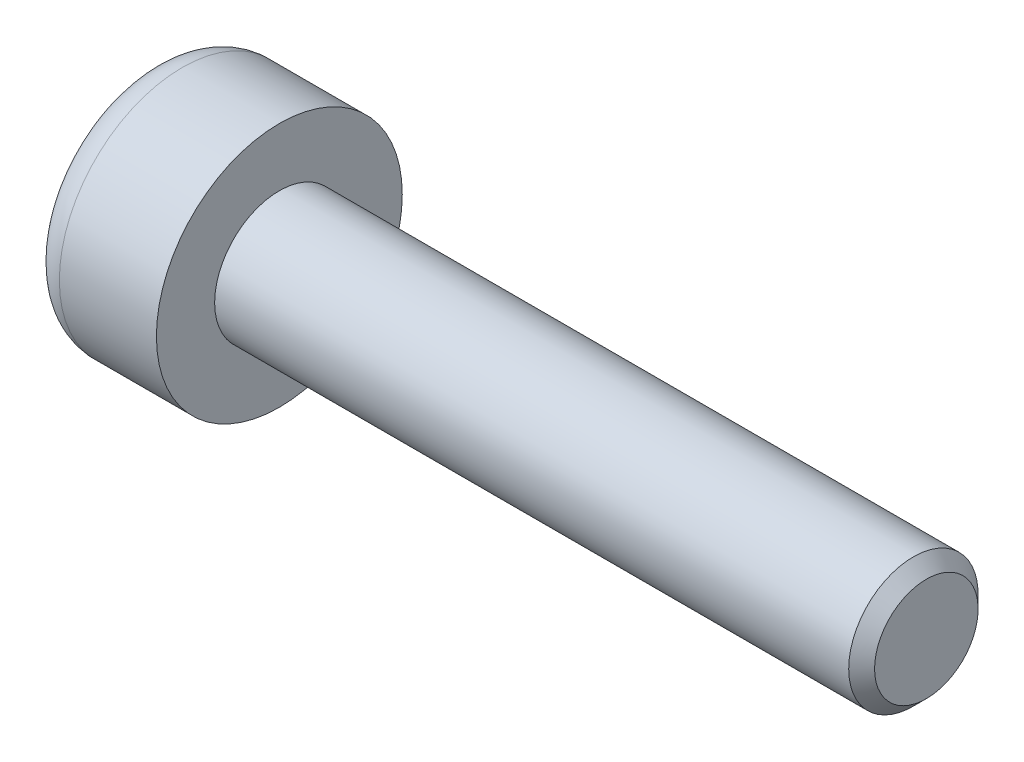
ISO-10303-21;
HEADER;
FILE_DESCRIPTION(('STEP AP214'),'2;1');
FILE_NAME('part.step','',(''),(''),'','','');
FILE_SCHEMA(('AUTOMOTIVE_DESIGN { 1 0 10303 214 1 1 1 1 }'));
ENDSEC;
DATA;
#1=APPLICATION_CONTEXT('core data for automotive mechanical design processes');
#2=APPLICATION_PROTOCOL_DEFINITION('international standard','automotive_design',2000,#1);
#3=PRODUCT_CONTEXT('',#1,'mechanical');
#4=PRODUCT('Part','Part','',(#3));
#5=PRODUCT_RELATED_PRODUCT_CATEGORY('part','',(#4));
#6=PRODUCT_DEFINITION_FORMATION('','',#4);
#7=PRODUCT_DEFINITION_CONTEXT('part definition',#1,'design');
#8=PRODUCT_DEFINITION('design','',#6,#7);
#9=PRODUCT_DEFINITION_SHAPE('','',#8);
#10=(LENGTH_UNIT() NAMED_UNIT(*) SI_UNIT(.MILLI.,.METRE.));
#11=(NAMED_UNIT(*) PLANE_ANGLE_UNIT() SI_UNIT($,.RADIAN.));
#12=(NAMED_UNIT(*) SI_UNIT($,.STERADIAN.) SOLID_ANGLE_UNIT());
#13=UNCERTAINTY_MEASURE_WITH_UNIT(LENGTH_MEASURE(1.E-05),#10,'distance_accuracy_value','');
#14=(GEOMETRIC_REPRESENTATION_CONTEXT(3) GLOBAL_UNCERTAINTY_ASSIGNED_CONTEXT((#13)) GLOBAL_UNIT_ASSIGNED_CONTEXT((#10,
#11,#12)) REPRESENTATION_CONTEXT('',''));
#15=CARTESIAN_POINT('',(0.,0.,0.));
#16=DIRECTION('',(0.,0.,1.));
#17=DIRECTION('',(1.,0.,0.));
#18=AXIS2_PLACEMENT_3D('',#15,#16,#17);
#19=CARTESIAN_POINT('',(0.,0.,0.));
#20=DIRECTION('',(1.,0.,0.));
#21=DIRECTION('',(0.,0.,-1.));
#22=AXIS2_PLACEMENT_3D('',#19,#20,#21);
#23=PLANE('',#22);
#24=DIRECTION('',(0.,0.866025403784439,0.5));
#25=VECTOR('',#24,1.);
#26=CARTESIAN_POINT('',(0.,-0.75,0.433012701892219));
#27=LINE('',#26,#25);
#28=CARTESIAN_POINT('',(0.,-0.75,0.433012701892219));
#29=VERTEX_POINT('',#28);
#30=CARTESIAN_POINT('',(0.,0.,0.866025403784439));
#31=VERTEX_POINT('',#30);
#32=EDGE_CURVE('E91',#29,#31,#27,.T.);
#33=ORIENTED_EDGE('',*,*,#32,.F.);
#34=DIRECTION('',(0.,0.,1.));
#35=VECTOR('',#34,1.);
#36=CARTESIAN_POINT('',(0.,-0.75,-0.43301270189222));
#37=LINE('',#36,#35);
#38=CARTESIAN_POINT('',(0.,-0.75,-0.43301270189222));
#39=VERTEX_POINT('',#38);
#40=EDGE_CURVE('E33',#39,#29,#37,.T.);
#41=ORIENTED_EDGE('',*,*,#40,.F.);
#42=DIRECTION('',(0.,-0.866025403784439,0.5));
#43=VECTOR('',#42,1.);
#44=CARTESIAN_POINT('',(0.,0.,-0.866025403784439));
#45=LINE('',#44,#43);
#46=CARTESIAN_POINT('',(0.,0.,-0.866025403784439));
#47=VERTEX_POINT('',#46);
#48=EDGE_CURVE('E106',#47,#39,#45,.T.);
#49=ORIENTED_EDGE('',*,*,#48,.F.);
#50=DIRECTION('',(0.,-0.866025403784439,-0.5));
#51=VECTOR('',#50,1.);
#52=CARTESIAN_POINT('',(0.,0.75,-0.43301270189222));
#53=LINE('',#52,#51);
#54=CARTESIAN_POINT('',(0.,0.75,-0.43301270189222));
#55=VERTEX_POINT('',#54);
#56=EDGE_CURVE('E100',#55,#47,#53,.T.);
#57=ORIENTED_EDGE('',*,*,#56,.F.);
#58=DIRECTION('',(0.,0.,-1.));
#59=VECTOR('',#58,1.);
#60=CARTESIAN_POINT('',(0.,0.75,0.433012701892219));
#61=LINE('',#60,#59);
#62=CARTESIAN_POINT('',(0.,0.75,0.433012701892219));
#63=VERTEX_POINT('',#62);
#64=EDGE_CURVE('E98',#63,#55,#61,.T.);
#65=ORIENTED_EDGE('',*,*,#64,.F.);
#66=DIRECTION('',(0.,0.866025403784439,-0.5));
#67=VECTOR('',#66,1.);
#68=CARTESIAN_POINT('',(0.,0.,0.866025403784439));
#69=LINE('',#68,#67);
#70=EDGE_CURVE('E84',#31,#63,#69,.T.);
#71=ORIENTED_EDGE('',*,*,#70,.F.);
#72=EDGE_LOOP('',(#33,#41,#49,#57,#65,#71));
#73=FACE_BOUND('',#72,.T.);
#74=CARTESIAN_POINT('',(0.,0.,0.));
#75=DIRECTION('',(-1.,0.,0.));
#76=DIRECTION('',(0.,0.,1.));
#77=AXIS2_PLACEMENT_3D('',#74,#75,#76);
#78=CIRCLE('',#77,1.4);
#79=CARTESIAN_POINT('',(0.,0.,1.4));
#80=VERTEX_POINT('',#79);
#81=EDGE_CURVE('E12',#80,#80,#78,.T.);
#82=ORIENTED_EDGE('',*,*,#81,.T.);
#83=EDGE_LOOP('',(#82));
#84=FACE_BOUND('',#83,.T.);
#85=ADVANCED_FACE('F19',(#73,#84),#23,.F.);
#86=CARTESIAN_POINT('',(0.5,0.,0.));
#87=DIRECTION('',(-1.,0.,0.));
#88=DIRECTION('',(0.,0.,1.));
#89=AXIS2_PLACEMENT_3D('',#86,#87,#88);
#90=TOROIDAL_SURFACE('',#89,1.4,0.5);
#91=ORIENTED_EDGE('',*,*,#81,.F.);
#92=EDGE_LOOP('',(#91));
#93=FACE_BOUND('',#92,.T.);
#94=CARTESIAN_POINT('',(0.5,0.,0.));
#95=DIRECTION('',(-1.,0.,0.));
#96=DIRECTION('',(0.,0.,1.));
#97=AXIS2_PLACEMENT_3D('',#94,#95,#96);
#98=CIRCLE('',#97,1.9);
#99=CARTESIAN_POINT('',(0.5,0.,1.9));
#100=VERTEX_POINT('',#99);
#101=EDGE_CURVE('E26',#100,#100,#98,.T.);
#102=ORIENTED_EDGE('',*,*,#101,.T.);
#103=EDGE_LOOP('',(#102));
#104=FACE_BOUND('',#103,.T.);
#105=ADVANCED_FACE('F132',(#93,#104),#90,.T.);
#106=CARTESIAN_POINT('',(0.,0.,0.));
#107=DIRECTION('',(-1.,0.,0.));
#108=DIRECTION('',(0.,0.,1.));
#109=AXIS2_PLACEMENT_3D('',#106,#107,#108);
#110=CYLINDRICAL_SURFACE('',#109,1.9);
#111=ORIENTED_EDGE('',*,*,#101,.F.);
#112=EDGE_LOOP('',(#111));
#113=FACE_BOUND('',#112,.T.);
#114=CARTESIAN_POINT('',(2.,0.,0.));
#115=DIRECTION('',(-1.,0.,0.));
#116=DIRECTION('',(0.,0.,1.));
#117=AXIS2_PLACEMENT_3D('',#114,#115,#116);
#118=CIRCLE('',#117,1.9);
#119=CARTESIAN_POINT('',(2.,0.,1.9));
#120=VERTEX_POINT('',#119);
#121=EDGE_CURVE('E127',#120,#120,#118,.T.);
#122=ORIENTED_EDGE('',*,*,#121,.T.);
#123=EDGE_LOOP('',(#122));
#124=FACE_BOUND('',#123,.T.);
#125=ADVANCED_FACE('F134',(#113,#124),#110,.T.);
#126=CARTESIAN_POINT('',(2.,1.9,0.));
#127=DIRECTION('',(-1.,0.,0.));
#128=DIRECTION('',(0.,0.,1.));
#129=AXIS2_PLACEMENT_3D('',#126,#127,#128);
#130=PLANE('',#129);
#131=ORIENTED_EDGE('',*,*,#121,.F.);
#132=EDGE_LOOP('',(#131));
#133=FACE_BOUND('',#132,.T.);
#134=CARTESIAN_POINT('',(2.,0.,0.));
#135=DIRECTION('',(-1.,0.,0.));
#136=DIRECTION('',(0.,0.,1.));
#137=AXIS2_PLACEMENT_3D('',#134,#135,#136);
#138=CIRCLE('',#137,1.);
#139=CARTESIAN_POINT('',(2.,0.,1.));
#140=VERTEX_POINT('',#139);
#141=EDGE_CURVE('E124',#140,#140,#138,.T.);
#142=ORIENTED_EDGE('',*,*,#141,.T.);
#143=EDGE_LOOP('',(#142));
#144=FACE_BOUND('',#143,.T.);
#145=ADVANCED_FACE('F137',(#133,#144),#130,.F.);
#146=CARTESIAN_POINT('',(0.,0.,0.));
#147=DIRECTION('',(-1.,0.,0.));
#148=DIRECTION('',(0.,0.,1.));
#149=AXIS2_PLACEMENT_3D('',#146,#147,#148);
#150=CYLINDRICAL_SURFACE('',#149,1.);
#151=ORIENTED_EDGE('',*,*,#141,.F.);
#152=EDGE_LOOP('',(#151));
#153=FACE_BOUND('',#152,.T.);
#154=CARTESIAN_POINT('',(11.8,0.,0.));
#155=DIRECTION('',(-1.,0.,0.));
#156=DIRECTION('',(0.,0.,1.));
#157=AXIS2_PLACEMENT_3D('',#154,#155,#156);
#158=CIRCLE('',#157,1.);
#159=CARTESIAN_POINT('',(11.8,0.,1.));
#160=VERTEX_POINT('',#159);
#161=EDGE_CURVE('E121',#160,#160,#158,.T.);
#162=ORIENTED_EDGE('',*,*,#161,.T.);
#163=EDGE_LOOP('',(#162));
#164=FACE_BOUND('',#163,.T.);
#165=ADVANCED_FACE('F143',(#153,#164),#150,.T.);
#166=CARTESIAN_POINT('',(12.,0.,0.));
#167=DIRECTION('',(-1.,0.,0.));
#168=DIRECTION('',(0.,0.,1.));
#169=AXIS2_PLACEMENT_3D('',#166,#167,#168);
#170=CONICAL_SURFACE('',#169,0.8,0.785398163397447);
#171=ORIENTED_EDGE('',*,*,#161,.F.);
#172=EDGE_LOOP('',(#171));
#173=FACE_BOUND('',#172,.T.);
#174=CARTESIAN_POINT('',(12.,0.,0.));
#175=DIRECTION('',(-1.,0.,0.));
#176=DIRECTION('',(0.,0.,1.));
#177=AXIS2_PLACEMENT_3D('',#174,#175,#176);
#178=CIRCLE('',#177,0.8);
#179=CARTESIAN_POINT('',(12.,0.,0.8));
#180=VERTEX_POINT('',#179);
#181=EDGE_CURVE('E118',#180,#180,#178,.T.);
#182=ORIENTED_EDGE('',*,*,#181,.T.);
#183=EDGE_LOOP('',(#182));
#184=FACE_BOUND('',#183,.T.);
#185=ADVANCED_FACE('F149',(#173,#184),#170,.T.);
#186=CARTESIAN_POINT('',(12.,0.8,0.));
#187=DIRECTION('',(-1.,0.,0.));
#188=DIRECTION('',(0.,0.,1.));
#189=AXIS2_PLACEMENT_3D('',#186,#187,#188);
#190=PLANE('',#189);
#191=ORIENTED_EDGE('',*,*,#181,.F.);
#192=EDGE_LOOP('',(#191));
#193=FACE_BOUND('',#192,.T.);
#194=ADVANCED_FACE('F155',(#193),#190,.F.);
#195=CARTESIAN_POINT('',(4.29128784747792,-0.75,-0.43301270189222));
#196=DIRECTION('',(0.,-1.,0.));
#197=DIRECTION('',(0.,0.,-1.));
#198=AXIS2_PLACEMENT_3D('',#195,#196,#197);
#199=PLANE('',#198);
#200=DIRECTION('',(0.,0.,-1.));
#201=VECTOR('',#200,1.);
#202=CARTESIAN_POINT('',(1.5,-0.75,-0.43301270189222));
#203=LINE('',#202,#201);
#204=CARTESIAN_POINT('',(1.5,-0.75,0.433012701892219));
#205=VERTEX_POINT('',#204);
#206=CARTESIAN_POINT('',(1.5,-0.75,-0.43301270189222));
#207=VERTEX_POINT('',#206);
#208=EDGE_CURVE('E52',#205,#207,#203,.T.);
#209=ORIENTED_EDGE('',*,*,#208,.T.);
#210=DIRECTION('',(-1.,0.,0.));
#211=VECTOR('',#210,1.);
#212=CARTESIAN_POINT('',(4.29128784747792,-0.75,-0.43301270189222));
#213=LINE('',#212,#211);
#214=EDGE_CURVE('E109',#207,#39,#213,.T.);
#215=ORIENTED_EDGE('',*,*,#214,.T.);
#216=ORIENTED_EDGE('',*,*,#40,.T.);
#217=DIRECTION('',(-1.,0.,0.));
#218=VECTOR('',#217,1.);
#219=CARTESIAN_POINT('',(4.29128784747792,-0.75,0.433012701892219));
#220=LINE('',#219,#218);
#221=EDGE_CURVE('E88',#205,#29,#220,.T.);
#222=ORIENTED_EDGE('',*,*,#221,.F.);
#223=EDGE_LOOP('',(#209,#215,#216,#222));
#224=FACE_BOUND('',#223,.T.);
#225=ADVANCED_FACE('F160',(#224),#199,.F.);
#226=CARTESIAN_POINT('',(4.29128784747792,0.,-0.866025403784439));
#227=DIRECTION('',(0.,-0.5,-0.866025403784439));
#228=DIRECTION('',(0.,0.866025403784439,-0.5));
#229=AXIS2_PLACEMENT_3D('',#226,#227,#228);
#230=PLANE('',#229);
#231=DIRECTION('',(0.,0.866025403784439,-0.5));
#232=VECTOR('',#231,1.);
#233=CARTESIAN_POINT('',(1.5,0.,-0.866025403784439));
#234=LINE('',#233,#232);
#235=CARTESIAN_POINT('',(1.5,0.,-0.866025403784439));
#236=VERTEX_POINT('',#235);
#237=EDGE_CURVE('E280',#207,#236,#234,.T.);
#238=ORIENTED_EDGE('',*,*,#237,.T.);
#239=DIRECTION('',(-1.,0.,0.));
#240=VECTOR('',#239,1.);
#241=CARTESIAN_POINT('',(4.29128784747792,0.,-0.866025403784439));
#242=LINE('',#241,#240);
#243=EDGE_CURVE('E111',#236,#47,#242,.T.);
#244=ORIENTED_EDGE('',*,*,#243,.T.);
#245=ORIENTED_EDGE('',*,*,#48,.T.);
#246=ORIENTED_EDGE('',*,*,#214,.F.);
#247=EDGE_LOOP('',(#238,#244,#245,#246));
#248=FACE_BOUND('',#247,.T.);
#249=ADVANCED_FACE('F167',(#248),#230,.F.);
#250=CARTESIAN_POINT('',(4.29128784747792,0.75,-0.43301270189222));
#251=DIRECTION('',(0.,0.5,-0.866025403784439));
#252=DIRECTION('',(0.,0.866025403784439,0.5));
#253=AXIS2_PLACEMENT_3D('',#250,#251,#252);
#254=PLANE('',#253);
#255=DIRECTION('',(0.,0.866025403784439,0.5));
#256=VECTOR('',#255,1.);
#257=CARTESIAN_POINT('',(1.5,0.75,-0.43301270189222));
#258=LINE('',#257,#256);
#259=CARTESIAN_POINT('',(1.5,0.75,-0.43301270189222));
#260=VERTEX_POINT('',#259);
#261=EDGE_CURVE('E283',#236,#260,#258,.T.);
#262=ORIENTED_EDGE('',*,*,#261,.T.);
#263=DIRECTION('',(-1.,0.,0.));
#264=VECTOR('',#263,1.);
#265=CARTESIAN_POINT('',(4.29128784747792,0.75,-0.43301270189222));
#266=LINE('',#265,#264);
#267=EDGE_CURVE('E113',#260,#55,#266,.T.);
#268=ORIENTED_EDGE('',*,*,#267,.T.);
#269=ORIENTED_EDGE('',*,*,#56,.T.);
#270=ORIENTED_EDGE('',*,*,#243,.F.);
#271=EDGE_LOOP('',(#262,#268,#269,#270));
#272=FACE_BOUND('',#271,.T.);
#273=ADVANCED_FACE('F231',(#272),#254,.F.);
#274=CARTESIAN_POINT('',(4.29128784747792,0.75,0.433012701892219));
#275=DIRECTION('',(0.,1.,0.));
#276=DIRECTION('',(0.,0.,1.));
#277=AXIS2_PLACEMENT_3D('',#274,#275,#276);
#278=PLANE('',#277);
#279=DIRECTION('',(0.,0.,1.));
#280=VECTOR('',#279,1.);
#281=CARTESIAN_POINT('',(1.5,0.75,0.433012701892219));
#282=LINE('',#281,#280);
#283=CARTESIAN_POINT('',(1.5,0.75,0.433012701892219));
#284=VERTEX_POINT('',#283);
#285=EDGE_CURVE('E42',#260,#284,#282,.T.);
#286=ORIENTED_EDGE('',*,*,#285,.T.);
#287=DIRECTION('',(-1.,0.,0.));
#288=VECTOR('',#287,1.);
#289=CARTESIAN_POINT('',(4.29128784747792,0.75,0.433012701892219));
#290=LINE('',#289,#288);
#291=EDGE_CURVE('E87',#284,#63,#290,.T.);
#292=ORIENTED_EDGE('',*,*,#291,.T.);
#293=ORIENTED_EDGE('',*,*,#64,.T.);
#294=ORIENTED_EDGE('',*,*,#267,.F.);
#295=EDGE_LOOP('',(#286,#292,#293,#294));
#296=FACE_BOUND('',#295,.T.);
#297=ADVANCED_FACE('F239',(#296),#278,.F.);
#298=CARTESIAN_POINT('',(4.29128784747792,0.,0.866025403784439));
#299=DIRECTION('',(0.,0.5,0.866025403784439));
#300=DIRECTION('',(0.,-0.866025403784439,0.5));
#301=AXIS2_PLACEMENT_3D('',#298,#299,#300);
#302=PLANE('',#301);
#303=DIRECTION('',(0.,-0.866025403784439,0.5));
#304=VECTOR('',#303,1.);
#305=CARTESIAN_POINT('',(1.5,0.,0.866025403784439));
#306=LINE('',#305,#304);
#307=CARTESIAN_POINT('',(1.5,0.,0.866025403784439));
#308=VERTEX_POINT('',#307);
#309=EDGE_CURVE('E86',#284,#308,#306,.T.);
#310=ORIENTED_EDGE('',*,*,#309,.T.);
#311=DIRECTION('',(-1.,0.,0.));
#312=VECTOR('',#311,1.);
#313=CARTESIAN_POINT('',(4.29128784747792,0.,0.866025403784439));
#314=LINE('',#313,#312);
#315=EDGE_CURVE('E79',#308,#31,#314,.T.);
#316=ORIENTED_EDGE('',*,*,#315,.T.);
#317=ORIENTED_EDGE('',*,*,#70,.T.);
#318=ORIENTED_EDGE('',*,*,#291,.F.);
#319=EDGE_LOOP('',(#310,#316,#317,#318));
#320=FACE_BOUND('',#319,.T.);
#321=ADVANCED_FACE('F81',(#320),#302,.F.);
#322=CARTESIAN_POINT('',(4.29128784747792,-0.75,0.433012701892219));
#323=DIRECTION('',(0.,-0.5,0.866025403784439));
#324=DIRECTION('',(0.,-0.866025403784439,-0.5));
#325=AXIS2_PLACEMENT_3D('',#322,#323,#324);
#326=PLANE('',#325);
#327=DIRECTION('',(0.,-0.866025403784439,-0.5));
#328=VECTOR('',#327,1.);
#329=CARTESIAN_POINT('',(1.5,-0.75,0.433012701892219));
#330=LINE('',#329,#328);
#331=EDGE_CURVE('E61',#308,#205,#330,.T.);
#332=ORIENTED_EDGE('',*,*,#331,.T.);
#333=ORIENTED_EDGE('',*,*,#221,.T.);
#334=ORIENTED_EDGE('',*,*,#32,.T.);
#335=ORIENTED_EDGE('',*,*,#315,.F.);
#336=EDGE_LOOP('',(#332,#333,#334,#335));
#337=FACE_BOUND('',#336,.T.);
#338=ADVANCED_FACE('F92',(#337),#326,.F.);
#339=CARTESIAN_POINT('',(1.5,1.9,0.));
#340=DIRECTION('',(-1.,0.,0.));
#341=DIRECTION('',(0.,0.,1.));
#342=AXIS2_PLACEMENT_3D('',#339,#340,#341);
#343=PLANE('',#342);
#344=ORIENTED_EDGE('',*,*,#208,.F.);
#345=ORIENTED_EDGE('',*,*,#331,.F.);
#346=ORIENTED_EDGE('',*,*,#309,.F.);
#347=ORIENTED_EDGE('',*,*,#285,.F.);
#348=ORIENTED_EDGE('',*,*,#261,.F.);
#349=ORIENTED_EDGE('',*,*,#237,.F.);
#350=EDGE_LOOP('',(#344,#345,#346,#347,#348,#349));
#351=FACE_BOUND('',#350,.T.);
#352=ADVANCED_FACE('F262',(#351),#343,.T.);
#353=CLOSED_SHELL('',(#85,#105,#125,#145,#165,#185,#194,#225,#249,#273,#297,#321,#338,#352));
#354=MANIFOLD_SOLID_BREP('B1',#353);
#355=ADVANCED_BREP_SHAPE_REPRESENTATION('',(#18,#354),#14);
#356=SHAPE_DEFINITION_REPRESENTATION(#9,#355);
ENDSEC;
END-ISO-10303-21;
